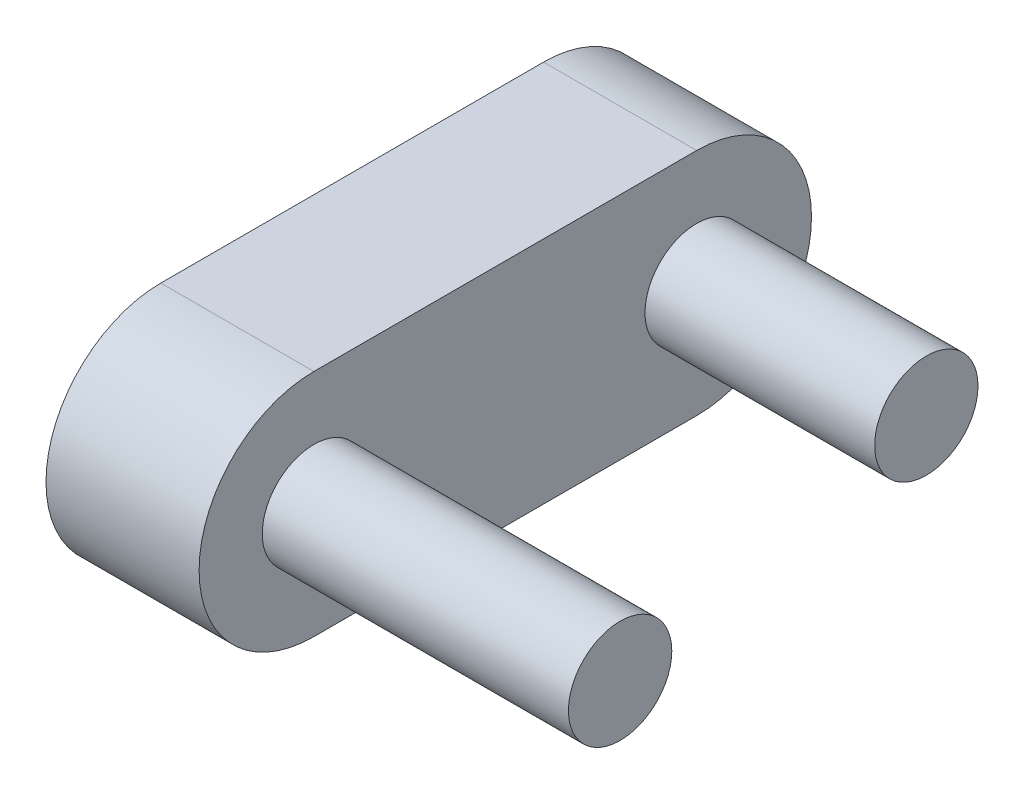
ISO-10303-21;
HEADER;
FILE_DESCRIPTION(('STEP AP214'),'2;1');
FILE_NAME('part.step','',(''),(''),'','','');
FILE_SCHEMA(('AUTOMOTIVE_DESIGN { 1 0 10303 214 1 1 1 1 }'));
ENDSEC;
DATA;
#1=APPLICATION_CONTEXT('core data for automotive mechanical design processes');
#2=APPLICATION_PROTOCOL_DEFINITION('international standard','automotive_design',2000,#1);
#3=PRODUCT_CONTEXT('',#1,'mechanical');
#4=PRODUCT('Part','Part','',(#3));
#5=PRODUCT_RELATED_PRODUCT_CATEGORY('part','',(#4));
#6=PRODUCT_DEFINITION_FORMATION('','',#4);
#7=PRODUCT_DEFINITION_CONTEXT('part definition',#1,'design');
#8=PRODUCT_DEFINITION('design','',#6,#7);
#9=PRODUCT_DEFINITION_SHAPE('','',#8);
#10=(LENGTH_UNIT() NAMED_UNIT(*) SI_UNIT(.MILLI.,.METRE.));
#11=(NAMED_UNIT(*) PLANE_ANGLE_UNIT() SI_UNIT($,.RADIAN.));
#12=(NAMED_UNIT(*) SI_UNIT($,.STERADIAN.) SOLID_ANGLE_UNIT());
#13=UNCERTAINTY_MEASURE_WITH_UNIT(LENGTH_MEASURE(1.E-05),#10,'distance_accuracy_value','');
#14=(GEOMETRIC_REPRESENTATION_CONTEXT(3) GLOBAL_UNCERTAINTY_ASSIGNED_CONTEXT((#13)) GLOBAL_UNIT_ASSIGNED_CONTEXT((#10,
#11,#12)) REPRESENTATION_CONTEXT('',''));
#15=CARTESIAN_POINT('',(0.,0.,0.));
#16=DIRECTION('',(0.,0.,1.));
#17=DIRECTION('',(1.,0.,0.));
#18=AXIS2_PLACEMENT_3D('',#15,#16,#17);
#19=CARTESIAN_POINT('',(1.,0.,2.5));
#20=DIRECTION('',(-1.,0.,0.));
#21=DIRECTION('',(0.,0.,1.));
#22=AXIS2_PLACEMENT_3D('',#19,#20,#21);
#23=CYLINDRICAL_SURFACE('',#22,1.5);
#24=CARTESIAN_POINT('',(-1.,0.,2.5));
#25=DIRECTION('',(1.,0.,0.));
#26=DIRECTION('',(0.,0.,-1.));
#27=AXIS2_PLACEMENT_3D('',#24,#25,#26);
#28=CIRCLE('',#27,1.5);
#29=CARTESIAN_POINT('',(-1.,1.5,2.5));
#30=VERTEX_POINT('',#29);
#31=CARTESIAN_POINT('',(-1.,-1.5,2.5));
#32=VERTEX_POINT('',#31);
#33=EDGE_CURVE('E110',#30,#32,#28,.T.);
#34=ORIENTED_EDGE('',*,*,#33,.T.);
#35=DIRECTION('',(-1.,0.,0.));
#36=VECTOR('',#35,1.);
#37=CARTESIAN_POINT('',(1.,-1.5,2.5));
#38=LINE('',#37,#36);
#39=CARTESIAN_POINT('',(1.,-1.5,2.5));
#40=VERTEX_POINT('',#39);
#41=EDGE_CURVE('E11',#40,#32,#38,.T.);
#42=ORIENTED_EDGE('',*,*,#41,.F.);
#43=CARTESIAN_POINT('',(1.,0.,2.5));
#44=DIRECTION('',(1.,0.,0.));
#45=DIRECTION('',(0.,0.,-1.));
#46=AXIS2_PLACEMENT_3D('',#43,#44,#45);
#47=CIRCLE('',#46,1.5);
#48=CARTESIAN_POINT('',(1.,1.5,2.5));
#49=VERTEX_POINT('',#48);
#50=EDGE_CURVE('E93',#49,#40,#47,.T.);
#51=ORIENTED_EDGE('',*,*,#50,.F.);
#52=DIRECTION('',(-1.,0.,0.));
#53=VECTOR('',#52,1.);
#54=CARTESIAN_POINT('',(1.,1.5,2.5));
#55=LINE('',#54,#53);
#56=EDGE_CURVE('E106',#49,#30,#55,.T.);
#57=ORIENTED_EDGE('',*,*,#56,.T.);
#58=EDGE_LOOP('',(#34,#42,#51,#57));
#59=FACE_BOUND('',#58,.T.);
#60=ADVANCED_FACE('F39',(#59),#23,.T.);
#61=CARTESIAN_POINT('',(1.,-1.5,-2.5));
#62=DIRECTION('',(0.,1.,0.));
#63=DIRECTION('',(0.,0.,1.));
#64=AXIS2_PLACEMENT_3D('',#61,#62,#63);
#65=PLANE('',#64);
#66=DIRECTION('',(0.,0.,-1.));
#67=VECTOR('',#66,1.);
#68=CARTESIAN_POINT('',(-1.,-1.5,-2.5));
#69=LINE('',#68,#67);
#70=CARTESIAN_POINT('',(-1.,-1.5,-2.5));
#71=VERTEX_POINT('',#70);
#72=EDGE_CURVE('E98',#32,#71,#69,.T.);
#73=ORIENTED_EDGE('',*,*,#72,.T.);
#74=DIRECTION('',(-1.,0.,0.));
#75=VECTOR('',#74,1.);
#76=CARTESIAN_POINT('',(1.,-1.5,-2.5));
#77=LINE('',#76,#75);
#78=CARTESIAN_POINT('',(1.,-1.5,-2.5));
#79=VERTEX_POINT('',#78);
#80=EDGE_CURVE('E49',#79,#71,#77,.T.);
#81=ORIENTED_EDGE('',*,*,#80,.F.);
#82=DIRECTION('',(0.,0.,-1.));
#83=VECTOR('',#82,1.);
#84=CARTESIAN_POINT('',(1.,-1.5,-2.5));
#85=LINE('',#84,#83);
#86=EDGE_CURVE('E88',#40,#79,#85,.T.);
#87=ORIENTED_EDGE('',*,*,#86,.F.);
#88=ORIENTED_EDGE('',*,*,#41,.T.);
#89=EDGE_LOOP('',(#73,#81,#87,#88));
#90=FACE_BOUND('',#89,.T.);
#91=ADVANCED_FACE('F97',(#90),#65,.F.);
#92=CARTESIAN_POINT('',(1.,0.,-2.5));
#93=DIRECTION('',(-1.,0.,0.));
#94=DIRECTION('',(0.,0.,1.));
#95=AXIS2_PLACEMENT_3D('',#92,#93,#94);
#96=CYLINDRICAL_SURFACE('',#95,1.5);
#97=CARTESIAN_POINT('',(-1.,0.,-2.5));
#98=DIRECTION('',(1.,0.,0.));
#99=DIRECTION('',(0.,0.,1.));
#100=AXIS2_PLACEMENT_3D('',#97,#98,#99);
#101=CIRCLE('',#100,1.5);
#102=CARTESIAN_POINT('',(-1.,1.5,-2.5));
#103=VERTEX_POINT('',#102);
#104=EDGE_CURVE('E75',#71,#103,#101,.T.);
#105=ORIENTED_EDGE('',*,*,#104,.T.);
#106=DIRECTION('',(-1.,0.,0.));
#107=VECTOR('',#106,1.);
#108=CARTESIAN_POINT('',(1.,1.5,-2.5));
#109=LINE('',#108,#107);
#110=CARTESIAN_POINT('',(1.,1.5,-2.5));
#111=VERTEX_POINT('',#110);
#112=EDGE_CURVE('E100',#111,#103,#109,.T.);
#113=ORIENTED_EDGE('',*,*,#112,.F.);
#114=CARTESIAN_POINT('',(1.,0.,-2.5));
#115=DIRECTION('',(1.,0.,0.));
#116=DIRECTION('',(0.,0.,1.));
#117=AXIS2_PLACEMENT_3D('',#114,#115,#116);
#118=CIRCLE('',#117,1.5);
#119=EDGE_CURVE('E91',#79,#111,#118,.T.);
#120=ORIENTED_EDGE('',*,*,#119,.F.);
#121=ORIENTED_EDGE('',*,*,#80,.T.);
#122=EDGE_LOOP('',(#105,#113,#120,#121));
#123=FACE_BOUND('',#122,.T.);
#124=ADVANCED_FACE('F102',(#123),#96,.T.);
#125=CARTESIAN_POINT('',(1.,1.5,2.5));
#126=DIRECTION('',(0.,-1.,0.));
#127=DIRECTION('',(0.,0.,-1.));
#128=AXIS2_PLACEMENT_3D('',#125,#126,#127);
#129=PLANE('',#128);
#130=DIRECTION('',(0.,0.,1.));
#131=VECTOR('',#130,1.);
#132=CARTESIAN_POINT('',(-1.,1.5,2.5));
#133=LINE('',#132,#131);
#134=EDGE_CURVE('E81',#103,#30,#133,.T.);
#135=ORIENTED_EDGE('',*,*,#134,.T.);
#136=ORIENTED_EDGE('',*,*,#56,.F.);
#137=DIRECTION('',(0.,0.,1.));
#138=VECTOR('',#137,1.);
#139=CARTESIAN_POINT('',(1.,1.5,2.5));
#140=LINE('',#139,#138);
#141=EDGE_CURVE('E58',#111,#49,#140,.T.);
#142=ORIENTED_EDGE('',*,*,#141,.F.);
#143=ORIENTED_EDGE('',*,*,#112,.T.);
#144=EDGE_LOOP('',(#135,#136,#142,#143));
#145=FACE_BOUND('',#144,.T.);
#146=ADVANCED_FACE('F174',(#145),#129,.F.);
#147=CARTESIAN_POINT('',(1.,0.,2.5));
#148=DIRECTION('',(1.,0.,0.));
#149=DIRECTION('',(0.,0.,-1.));
#150=AXIS2_PLACEMENT_3D('',#147,#148,#149);
#151=PLANE('',#150);
#152=CARTESIAN_POINT('',(1.,0.,-2.5));
#153=DIRECTION('',(1.,0.,0.));
#154=DIRECTION('',(0.,0.,-1.));
#155=AXIS2_PLACEMENT_3D('',#152,#153,#154);
#156=CIRCLE('',#155,0.675);
#157=CARTESIAN_POINT('',(1.,0.,-3.175));
#158=VERTEX_POINT('',#157);
#159=EDGE_CURVE('E42',#158,#158,#156,.F.);
#160=ORIENTED_EDGE('',*,*,#159,.T.);
#161=EDGE_LOOP('',(#160));
#162=FACE_BOUND('',#161,.T.);
#163=CARTESIAN_POINT('',(1.,0.,2.5));
#164=DIRECTION('',(1.,0.,0.));
#165=DIRECTION('',(0.,0.,-1.));
#166=AXIS2_PLACEMENT_3D('',#163,#164,#165);
#167=CIRCLE('',#166,0.675);
#168=CARTESIAN_POINT('',(1.,0.,1.825));
#169=VERTEX_POINT('',#168);
#170=EDGE_CURVE('E114',#169,#169,#167,.F.);
#171=ORIENTED_EDGE('',*,*,#170,.T.);
#172=EDGE_LOOP('',(#171));
#173=FACE_BOUND('',#172,.T.);
#174=ORIENTED_EDGE('',*,*,#50,.T.);
#175=ORIENTED_EDGE('',*,*,#86,.T.);
#176=ORIENTED_EDGE('',*,*,#119,.T.);
#177=ORIENTED_EDGE('',*,*,#141,.T.);
#178=EDGE_LOOP('',(#174,#175,#176,#177));
#179=FACE_BOUND('',#178,.T.);
#180=ADVANCED_FACE('F89',(#162,#173,#179),#151,.T.);
#181=CARTESIAN_POINT('',(-1.,0.,2.5));
#182=DIRECTION('',(1.,0.,0.));
#183=DIRECTION('',(0.,0.,-1.));
#184=AXIS2_PLACEMENT_3D('',#181,#182,#183);
#185=PLANE('',#184);
#186=ORIENTED_EDGE('',*,*,#33,.F.);
#187=ORIENTED_EDGE('',*,*,#134,.F.);
#188=ORIENTED_EDGE('',*,*,#104,.F.);
#189=ORIENTED_EDGE('',*,*,#72,.F.);
#190=EDGE_LOOP('',(#186,#187,#188,#189));
#191=FACE_BOUND('',#190,.T.);
#192=ADVANCED_FACE('F165',(#191),#185,.F.);
#193=CARTESIAN_POINT('',(5.,0.,2.5));
#194=DIRECTION('',(-1.,0.,0.));
#195=DIRECTION('',(0.,0.,1.));
#196=AXIS2_PLACEMENT_3D('',#193,#194,#195);
#197=CYLINDRICAL_SURFACE('',#196,0.675);
#198=ORIENTED_EDGE('',*,*,#170,.F.);
#199=EDGE_LOOP('',(#198));
#200=FACE_BOUND('',#199,.T.);
#201=CARTESIAN_POINT('',(5.,0.,2.5));
#202=DIRECTION('',(1.,0.,0.));
#203=DIRECTION('',(0.,0.,-1.));
#204=AXIS2_PLACEMENT_3D('',#201,#202,#203);
#205=CIRCLE('',#204,0.675);
#206=CARTESIAN_POINT('',(5.,0.,1.825));
#207=VERTEX_POINT('',#206);
#208=EDGE_CURVE('E126',#207,#207,#205,.T.);
#209=ORIENTED_EDGE('',*,*,#208,.F.);
#210=EDGE_LOOP('',(#209));
#211=FACE_BOUND('',#210,.T.);
#212=ADVANCED_FACE('F155',(#200,#211),#197,.T.);
#213=CARTESIAN_POINT('',(5.,0.,2.5));
#214=DIRECTION('',(1.,0.,0.));
#215=DIRECTION('',(0.,0.,-1.));
#216=AXIS2_PLACEMENT_3D('',#213,#214,#215);
#217=PLANE('',#216);
#218=ORIENTED_EDGE('',*,*,#208,.T.);
#219=EDGE_LOOP('',(#218));
#220=FACE_BOUND('',#219,.T.);
#221=ADVANCED_FACE('F147',(#220),#217,.T.);
#222=CARTESIAN_POINT('',(4.,0.,-2.5));
#223=DIRECTION('',(-1.,0.,0.));
#224=DIRECTION('',(0.,0.,1.));
#225=AXIS2_PLACEMENT_3D('',#222,#223,#224);
#226=CYLINDRICAL_SURFACE('',#225,0.675);
#227=ORIENTED_EDGE('',*,*,#159,.F.);
#228=EDGE_LOOP('',(#227));
#229=FACE_BOUND('',#228,.T.);
#230=CARTESIAN_POINT('',(4.,0.,-2.5));
#231=DIRECTION('',(1.,0.,0.));
#232=DIRECTION('',(0.,0.,-1.));
#233=AXIS2_PLACEMENT_3D('',#230,#231,#232);
#234=CIRCLE('',#233,0.675);
#235=CARTESIAN_POINT('',(4.,0.,-3.175));
#236=VERTEX_POINT('',#235);
#237=EDGE_CURVE('E136',#236,#236,#234,.T.);
#238=ORIENTED_EDGE('',*,*,#237,.F.);
#239=EDGE_LOOP('',(#238));
#240=FACE_BOUND('',#239,.T.);
#241=ADVANCED_FACE('F145',(#229,#240),#226,.T.);
#242=CARTESIAN_POINT('',(4.,0.,-2.5));
#243=DIRECTION('',(1.,0.,0.));
#244=DIRECTION('',(0.,0.,-1.));
#245=AXIS2_PLACEMENT_3D('',#242,#243,#244);
#246=PLANE('',#245);
#247=ORIENTED_EDGE('',*,*,#237,.T.);
#248=EDGE_LOOP('',(#247));
#249=FACE_BOUND('',#248,.T.);
#250=ADVANCED_FACE('F143',(#249),#246,.T.);
#251=CLOSED_SHELL('',(#60,#91,#124,#146,#180,#192,#212,#221,#241,#250));
#252=MANIFOLD_SOLID_BREP('B2',#251);
#253=ADVANCED_BREP_SHAPE_REPRESENTATION('',(#18,#252),#14);
#254=SHAPE_DEFINITION_REPRESENTATION(#9,#253);
ENDSEC;
END-ISO-10303-21;
